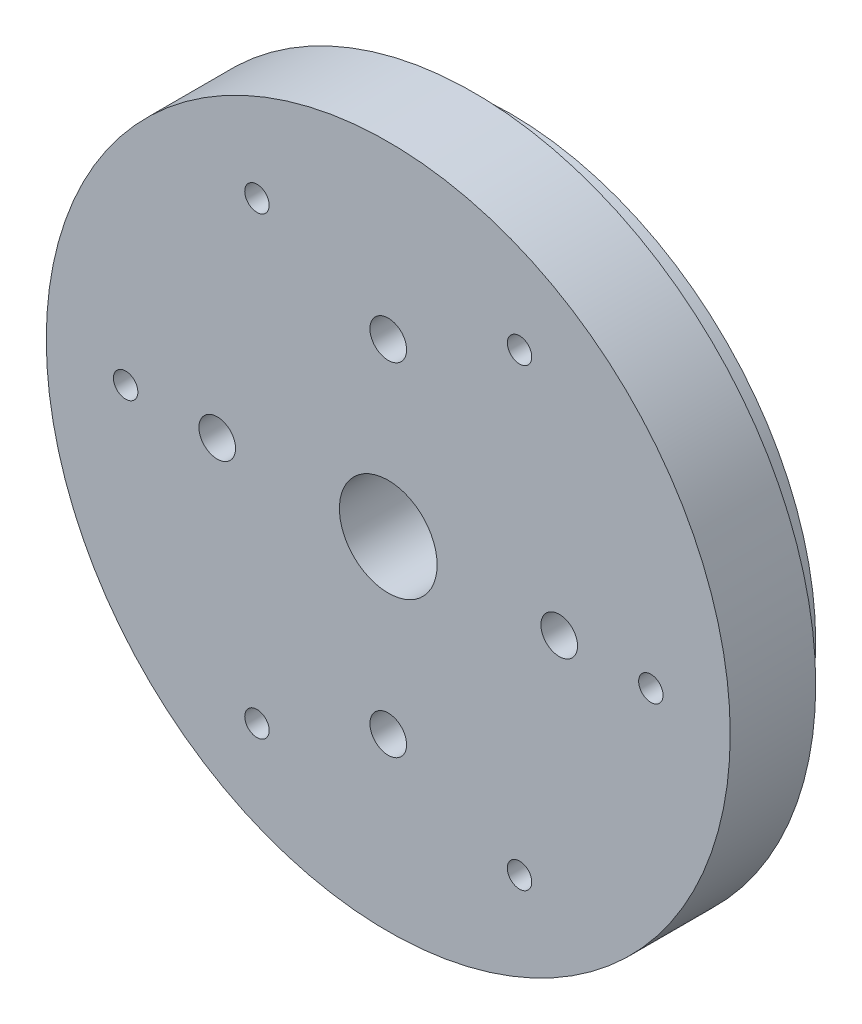
ISO-10303-21;
HEADER;
FILE_DESCRIPTION(('STEP AP214'),'2;1');
FILE_NAME('part.step','',(''),(''),'','','');
FILE_SCHEMA(('AUTOMOTIVE_DESIGN { 1 0 10303 214 1 1 1 1 }'));
ENDSEC;
DATA;
#1=APPLICATION_CONTEXT('core data for automotive mechanical design processes');
#2=APPLICATION_PROTOCOL_DEFINITION('international standard','automotive_design',2000,#1);
#3=PRODUCT_CONTEXT('',#1,'mechanical');
#4=PRODUCT('Part','Part','',(#3));
#5=PRODUCT_RELATED_PRODUCT_CATEGORY('part','',(#4));
#6=PRODUCT_DEFINITION_FORMATION('','',#4);
#7=PRODUCT_DEFINITION_CONTEXT('part definition',#1,'design');
#8=PRODUCT_DEFINITION('design','',#6,#7);
#9=PRODUCT_DEFINITION_SHAPE('','',#8);
#10=(LENGTH_UNIT() NAMED_UNIT(*) SI_UNIT(.MILLI.,.METRE.));
#11=(NAMED_UNIT(*) PLANE_ANGLE_UNIT() SI_UNIT($,.RADIAN.));
#12=(NAMED_UNIT(*) SI_UNIT($,.STERADIAN.) SOLID_ANGLE_UNIT());
#13=UNCERTAINTY_MEASURE_WITH_UNIT(LENGTH_MEASURE(1.E-05),#10,'distance_accuracy_value','');
#14=(GEOMETRIC_REPRESENTATION_CONTEXT(3) GLOBAL_UNCERTAINTY_ASSIGNED_CONTEXT((#13)) GLOBAL_UNIT_ASSIGNED_CONTEXT((#10,
#11,#12)) REPRESENTATION_CONTEXT('',''));
#15=CARTESIAN_POINT('',(0.,0.,0.));
#16=DIRECTION('',(0.,0.,1.));
#17=DIRECTION('',(1.,0.,0.));
#18=AXIS2_PLACEMENT_3D('',#15,#16,#17);
#19=CARTESIAN_POINT('',(0.,0.,0.));
#20=DIRECTION('',(0.,0.,1.));
#21=DIRECTION('',(1.,0.,0.));
#22=AXIS2_PLACEMENT_3D('',#19,#20,#21);
#23=PLANE('',#22);
#24=CARTESIAN_POINT('',(-14.,0.,0.));
#25=DIRECTION('',(0.,0.,1.));
#26=DIRECTION('',(1.,0.,0.));
#27=AXIS2_PLACEMENT_3D('',#24,#25,#26);
#28=CIRCLE('',#27,1.5);
#29=CARTESIAN_POINT('',(-12.5,0.,0.));
#30=VERTEX_POINT('',#29);
#31=EDGE_CURVE('E76',#30,#30,#28,.T.);
#32=ORIENTED_EDGE('',*,*,#31,.T.);
#33=EDGE_LOOP('',(#32));
#34=FACE_BOUND('',#33,.T.);
#35=CARTESIAN_POINT('',(0.,-14.,0.));
#36=DIRECTION('',(0.,0.,1.));
#37=DIRECTION('',(1.,0.,0.));
#38=AXIS2_PLACEMENT_3D('',#35,#36,#37);
#39=CIRCLE('',#38,1.5);
#40=CARTESIAN_POINT('',(1.5,-14.,0.));
#41=VERTEX_POINT('',#40);
#42=EDGE_CURVE('E70',#41,#41,#39,.T.);
#43=ORIENTED_EDGE('',*,*,#42,.T.);
#44=EDGE_LOOP('',(#43));
#45=FACE_BOUND('',#44,.T.);
#46=CARTESIAN_POINT('',(14.,0.,0.));
#47=DIRECTION('',(0.,0.,1.));
#48=DIRECTION('',(1.,0.,0.));
#49=AXIS2_PLACEMENT_3D('',#46,#47,#48);
#50=CIRCLE('',#49,1.5);
#51=CARTESIAN_POINT('',(15.5,0.,0.));
#52=VERTEX_POINT('',#51);
#53=EDGE_CURVE('E64',#52,#52,#50,.T.);
#54=ORIENTED_EDGE('',*,*,#53,.T.);
#55=EDGE_LOOP('',(#54));
#56=FACE_BOUND('',#55,.T.);
#57=CARTESIAN_POINT('',(0.,14.,0.));
#58=DIRECTION('',(0.,0.,1.));
#59=DIRECTION('',(1.,0.,0.));
#60=AXIS2_PLACEMENT_3D('',#57,#58,#59);
#61=CIRCLE('',#60,1.5);
#62=CARTESIAN_POINT('',(1.5,14.,0.));
#63=VERTEX_POINT('',#62);
#64=EDGE_CURVE('E58',#63,#63,#61,.T.);
#65=ORIENTED_EDGE('',*,*,#64,.T.);
#66=EDGE_LOOP('',(#65));
#67=FACE_BOUND('',#66,.T.);
#68=CARTESIAN_POINT('',(0.,0.,0.));
#69=DIRECTION('',(0.,0.,1.));
#70=DIRECTION('',(1.,0.,0.));
#71=AXIS2_PLACEMENT_3D('',#68,#69,#70);
#72=CIRCLE('',#71,4.);
#73=CARTESIAN_POINT('',(4.,0.,0.));
#74=VERTEX_POINT('',#73);
#75=EDGE_CURVE('E52',#74,#74,#72,.T.);
#76=ORIENTED_EDGE('',*,*,#75,.T.);
#77=EDGE_LOOP('',(#76));
#78=FACE_BOUND('',#77,.T.);
#79=CARTESIAN_POINT('',(0.,0.,0.));
#80=DIRECTION('',(0.,0.,-1.));
#81=DIRECTION('',(-1.,0.,0.));
#82=AXIS2_PLACEMENT_3D('',#79,#80,#81);
#83=CIRCLE('',#82,18.);
#84=CARTESIAN_POINT('',(-18.,0.,0.));
#85=VERTEX_POINT('',#84);
#86=EDGE_CURVE('E85',#85,#85,#83,.T.);
#87=ORIENTED_EDGE('',*,*,#86,.T.);
#88=EDGE_LOOP('',(#87));
#89=FACE_BOUND('',#88,.T.);
#90=ADVANCED_FACE('F34',(#34,#45,#56,#67,#78,#89),#23,.F.);
#91=CARTESIAN_POINT('',(0.,0.,7.));
#92=DIRECTION('',(0.,0.,1.));
#93=DIRECTION('',(1.,0.,0.));
#94=AXIS2_PLACEMENT_3D('',#91,#92,#93);
#95=PLANE('',#94);
#96=CARTESIAN_POINT('',(21.5,0.,7.));
#97=DIRECTION('',(0.,0.,-1.));
#98=DIRECTION('',(-1.,0.,0.));
#99=AXIS2_PLACEMENT_3D('',#96,#97,#98);
#100=CIRCLE('',#99,1.);
#101=CARTESIAN_POINT('',(20.5,0.,7.));
#102=VERTEX_POINT('',#101);
#103=EDGE_CURVE('E100',#102,#102,#100,.T.);
#104=ORIENTED_EDGE('',*,*,#103,.T.);
#105=EDGE_LOOP('',(#104));
#106=FACE_BOUND('',#105,.T.);
#107=CARTESIAN_POINT('',(10.7500000000001,-18.6195461813654,7.));
#108=DIRECTION('',(0.,0.,-1.));
#109=DIRECTION('',(-1.,0.,0.));
#110=AXIS2_PLACEMENT_3D('',#107,#108,#109);
#111=CIRCLE('',#110,1.);
#112=CARTESIAN_POINT('',(9.75000000000009,-18.6195461813654,7.));
#113=VERTEX_POINT('',#112);
#114=EDGE_CURVE('E106',#113,#113,#111,.T.);
#115=ORIENTED_EDGE('',*,*,#114,.T.);
#116=EDGE_LOOP('',(#115));
#117=FACE_BOUND('',#116,.T.);
#118=CARTESIAN_POINT('',(-10.75,-18.6195461813655,7.));
#119=DIRECTION('',(0.,0.,-1.));
#120=DIRECTION('',(-1.,0.,0.));
#121=AXIS2_PLACEMENT_3D('',#118,#119,#120);
#122=CIRCLE('',#121,1.);
#123=CARTESIAN_POINT('',(-11.75,-18.6195461813655,7.));
#124=VERTEX_POINT('',#123);
#125=EDGE_CURVE('E112',#124,#124,#122,.T.);
#126=ORIENTED_EDGE('',*,*,#125,.T.);
#127=EDGE_LOOP('',(#126));
#128=FACE_BOUND('',#127,.T.);
#129=CARTESIAN_POINT('',(-21.5,0.,7.));
#130=DIRECTION('',(0.,0.,-1.));
#131=DIRECTION('',(-1.,0.,0.));
#132=AXIS2_PLACEMENT_3D('',#129,#130,#131);
#133=CIRCLE('',#132,1.);
#134=CARTESIAN_POINT('',(-22.5,0.,7.));
#135=VERTEX_POINT('',#134);
#136=EDGE_CURVE('E118',#135,#135,#133,.T.);
#137=ORIENTED_EDGE('',*,*,#136,.T.);
#138=EDGE_LOOP('',(#137));
#139=FACE_BOUND('',#138,.T.);
#140=CARTESIAN_POINT('',(-10.7500000000001,18.6195461813654,7.));
#141=DIRECTION('',(0.,0.,-1.));
#142=DIRECTION('',(-1.,0.,0.));
#143=AXIS2_PLACEMENT_3D('',#140,#141,#142);
#144=CIRCLE('',#143,1.);
#145=CARTESIAN_POINT('',(-11.7500000000001,18.6195461813654,7.));
#146=VERTEX_POINT('',#145);
#147=EDGE_CURVE('E94',#146,#146,#144,.T.);
#148=ORIENTED_EDGE('',*,*,#147,.T.);
#149=EDGE_LOOP('',(#148));
#150=FACE_BOUND('',#149,.T.);
#151=CARTESIAN_POINT('',(10.75,18.6195461813655,7.));
#152=DIRECTION('',(0.,0.,-1.));
#153=DIRECTION('',(-1.,0.,0.));
#154=AXIS2_PLACEMENT_3D('',#151,#152,#153);
#155=CIRCLE('',#154,1.);
#156=CARTESIAN_POINT('',(9.74999999999995,18.6195461813655,7.));
#157=VERTEX_POINT('',#156);
#158=EDGE_CURVE('E88',#157,#157,#155,.T.);
#159=ORIENTED_EDGE('',*,*,#158,.T.);
#160=EDGE_LOOP('',(#159));
#161=FACE_BOUND('',#160,.T.);
#162=CARTESIAN_POINT('',(0.,-14.,7.));
#163=DIRECTION('',(0.,0.,1.));
#164=DIRECTION('',(1.,0.,0.));
#165=AXIS2_PLACEMENT_3D('',#162,#163,#164);
#166=CIRCLE('',#165,1.5);
#167=CARTESIAN_POINT('',(1.5,-14.,7.));
#168=VERTEX_POINT('',#167);
#169=EDGE_CURVE('E67',#168,#168,#166,.T.);
#170=ORIENTED_EDGE('',*,*,#169,.F.);
#171=EDGE_LOOP('',(#170));
#172=FACE_BOUND('',#171,.T.);
#173=CARTESIAN_POINT('',(0.,14.,7.));
#174=DIRECTION('',(0.,0.,1.));
#175=DIRECTION('',(1.,0.,0.));
#176=AXIS2_PLACEMENT_3D('',#173,#174,#175);
#177=CIRCLE('',#176,1.5);
#178=CARTESIAN_POINT('',(1.5,14.,7.));
#179=VERTEX_POINT('',#178);
#180=EDGE_CURVE('E55',#179,#179,#177,.T.);
#181=ORIENTED_EDGE('',*,*,#180,.F.);
#182=EDGE_LOOP('',(#181));
#183=FACE_BOUND('',#182,.T.);
#184=CARTESIAN_POINT('',(0.,0.,7.));
#185=DIRECTION('',(0.,0.,1.));
#186=DIRECTION('',(1.,0.,0.));
#187=AXIS2_PLACEMENT_3D('',#184,#185,#186);
#188=CIRCLE('',#187,28.);
#189=CARTESIAN_POINT('',(28.,0.,7.));
#190=VERTEX_POINT('',#189);
#191=EDGE_CURVE('E41',#190,#190,#188,.T.);
#192=ORIENTED_EDGE('',*,*,#191,.T.);
#193=EDGE_LOOP('',(#192));
#194=FACE_BOUND('',#193,.T.);
#195=CARTESIAN_POINT('',(0.,0.,7.));
#196=DIRECTION('',(0.,0.,1.));
#197=DIRECTION('',(1.,0.,0.));
#198=AXIS2_PLACEMENT_3D('',#195,#196,#197);
#199=CIRCLE('',#198,4.);
#200=CARTESIAN_POINT('',(4.,0.,7.));
#201=VERTEX_POINT('',#200);
#202=EDGE_CURVE('E50',#201,#201,#199,.T.);
#203=ORIENTED_EDGE('',*,*,#202,.F.);
#204=EDGE_LOOP('',(#203));
#205=FACE_BOUND('',#204,.T.);
#206=CARTESIAN_POINT('',(14.,0.,7.));
#207=DIRECTION('',(0.,0.,1.));
#208=DIRECTION('',(1.,0.,0.));
#209=AXIS2_PLACEMENT_3D('',#206,#207,#208);
#210=CIRCLE('',#209,1.5);
#211=CARTESIAN_POINT('',(15.5,0.,7.));
#212=VERTEX_POINT('',#211);
#213=EDGE_CURVE('E61',#212,#212,#210,.T.);
#214=ORIENTED_EDGE('',*,*,#213,.F.);
#215=EDGE_LOOP('',(#214));
#216=FACE_BOUND('',#215,.T.);
#217=CARTESIAN_POINT('',(-14.,0.,7.));
#218=DIRECTION('',(0.,0.,1.));
#219=DIRECTION('',(1.,0.,0.));
#220=AXIS2_PLACEMENT_3D('',#217,#218,#219);
#221=CIRCLE('',#220,1.5);
#222=CARTESIAN_POINT('',(-12.5,0.,7.));
#223=VERTEX_POINT('',#222);
#224=EDGE_CURVE('E73',#223,#223,#221,.T.);
#225=ORIENTED_EDGE('',*,*,#224,.F.);
#226=EDGE_LOOP('',(#225));
#227=FACE_BOUND('',#226,.T.);
#228=ADVANCED_FACE('F127',(#106,#117,#128,#139,#150,#161,#172,#183,#194,#205,#216,#227),#95,.T.);
#229=CARTESIAN_POINT('',(0.,0.,0.));
#230=DIRECTION('',(0.,0.,1.));
#231=DIRECTION('',(1.,0.,0.));
#232=AXIS2_PLACEMENT_3D('',#229,#230,#231);
#233=CIRCLE('',#232,25.);
#234=CARTESIAN_POINT('',(25.,0.,0.));
#235=VERTEX_POINT('',#234);
#236=EDGE_CURVE('E10',#235,#235,#233,.F.);
#237=ORIENTED_EDGE('',*,*,#236,.F.);
#238=EDGE_LOOP('',(#237));
#239=FACE_BOUND('',#238,.T.);
#240=CARTESIAN_POINT('',(0.,0.,0.));
#241=DIRECTION('',(0.,0.,1.));
#242=DIRECTION('',(1.,0.,0.));
#243=AXIS2_PLACEMENT_3D('',#240,#241,#242);
#244=CIRCLE('',#243,28.);
#245=CARTESIAN_POINT('',(28.,0.,0.));
#246=VERTEX_POINT('',#245);
#247=EDGE_CURVE('E45',#246,#246,#244,.T.);
#248=ORIENTED_EDGE('',*,*,#247,.F.);
#249=EDGE_LOOP('',(#248));
#250=FACE_BOUND('',#249,.T.);
#251=ADVANCED_FACE('F159',(#239,#250),#23,.F.);
#252=CARTESIAN_POINT('',(0.,0.,7.));
#253=DIRECTION('',(0.,0.,-1.));
#254=DIRECTION('',(-1.,0.,0.));
#255=AXIS2_PLACEMENT_3D('',#252,#253,#254);
#256=CYLINDRICAL_SURFACE('',#255,28.);
#257=ORIENTED_EDGE('',*,*,#191,.F.);
#258=EDGE_LOOP('',(#257));
#259=FACE_BOUND('',#258,.T.);
#260=ORIENTED_EDGE('',*,*,#247,.T.);
#261=EDGE_LOOP('',(#260));
#262=FACE_BOUND('',#261,.T.);
#263=ADVANCED_FACE('F36',(#259,#262),#256,.T.);
#264=CARTESIAN_POINT('',(0.,0.,7.));
#265=DIRECTION('',(0.,0.,-1.));
#266=DIRECTION('',(-1.,0.,0.));
#267=AXIS2_PLACEMENT_3D('',#264,#265,#266);
#268=CYLINDRICAL_SURFACE('',#267,4.);
#269=ORIENTED_EDGE('',*,*,#202,.T.);
#270=EDGE_LOOP('',(#269));
#271=FACE_BOUND('',#270,.T.);
#272=ORIENTED_EDGE('',*,*,#75,.F.);
#273=EDGE_LOOP('',(#272));
#274=FACE_BOUND('',#273,.T.);
#275=ADVANCED_FACE('F171',(#271,#274),#268,.F.);
#276=CARTESIAN_POINT('',(0.,14.,7.));
#277=DIRECTION('',(0.,0.,-1.));
#278=DIRECTION('',(-1.,0.,0.));
#279=AXIS2_PLACEMENT_3D('',#276,#277,#278);
#280=CYLINDRICAL_SURFACE('',#279,1.5);
#281=ORIENTED_EDGE('',*,*,#180,.T.);
#282=EDGE_LOOP('',(#281));
#283=FACE_BOUND('',#282,.T.);
#284=ORIENTED_EDGE('',*,*,#64,.F.);
#285=EDGE_LOOP('',(#284));
#286=FACE_BOUND('',#285,.T.);
#287=ADVANCED_FACE('F179',(#283,#286),#280,.F.);
#288=CARTESIAN_POINT('',(14.,0.,7.));
#289=DIRECTION('',(0.,0.,-1.));
#290=DIRECTION('',(-1.,0.,0.));
#291=AXIS2_PLACEMENT_3D('',#288,#289,#290);
#292=CYLINDRICAL_SURFACE('',#291,1.5);
#293=ORIENTED_EDGE('',*,*,#213,.T.);
#294=EDGE_LOOP('',(#293));
#295=FACE_BOUND('',#294,.T.);
#296=ORIENTED_EDGE('',*,*,#53,.F.);
#297=EDGE_LOOP('',(#296));
#298=FACE_BOUND('',#297,.T.);
#299=ADVANCED_FACE('F185',(#295,#298),#292,.F.);
#300=CARTESIAN_POINT('',(0.,-14.,7.));
#301=DIRECTION('',(0.,0.,-1.));
#302=DIRECTION('',(-1.,0.,0.));
#303=AXIS2_PLACEMENT_3D('',#300,#301,#302);
#304=CYLINDRICAL_SURFACE('',#303,1.5);
#305=ORIENTED_EDGE('',*,*,#169,.T.);
#306=EDGE_LOOP('',(#305));
#307=FACE_BOUND('',#306,.T.);
#308=ORIENTED_EDGE('',*,*,#42,.F.);
#309=EDGE_LOOP('',(#308));
#310=FACE_BOUND('',#309,.T.);
#311=ADVANCED_FACE('F192',(#307,#310),#304,.F.);
#312=CARTESIAN_POINT('',(-14.,0.,7.));
#313=DIRECTION('',(0.,0.,-1.));
#314=DIRECTION('',(-1.,0.,0.));
#315=AXIS2_PLACEMENT_3D('',#312,#313,#314);
#316=CYLINDRICAL_SURFACE('',#315,1.5);
#317=ORIENTED_EDGE('',*,*,#224,.T.);
#318=EDGE_LOOP('',(#317));
#319=FACE_BOUND('',#318,.T.);
#320=ORIENTED_EDGE('',*,*,#31,.F.);
#321=EDGE_LOOP('',(#320));
#322=FACE_BOUND('',#321,.T.);
#323=ADVANCED_FACE('F142',(#319,#322),#316,.F.);
#324=CARTESIAN_POINT('',(0.,0.,-3.));
#325=DIRECTION('',(0.,0.,-1.));
#326=DIRECTION('',(-1.,0.,0.));
#327=AXIS2_PLACEMENT_3D('',#324,#325,#326);
#328=PLANE('',#327);
#329=CARTESIAN_POINT('',(21.5,0.,-3.));
#330=DIRECTION('',(0.,0.,-1.));
#331=DIRECTION('',(-1.,0.,0.));
#332=AXIS2_PLACEMENT_3D('',#329,#330,#331);
#333=CIRCLE('',#332,1.);
#334=CARTESIAN_POINT('',(20.5,0.,-3.));
#335=VERTEX_POINT('',#334);
#336=EDGE_CURVE('E97',#335,#335,#333,.T.);
#337=ORIENTED_EDGE('',*,*,#336,.F.);
#338=EDGE_LOOP('',(#337));
#339=FACE_BOUND('',#338,.T.);
#340=CARTESIAN_POINT('',(10.7500000000001,-18.6195461813654,-3.));
#341=DIRECTION('',(0.,0.,-1.));
#342=DIRECTION('',(-1.,0.,0.));
#343=AXIS2_PLACEMENT_3D('',#340,#341,#342);
#344=CIRCLE('',#343,1.);
#345=CARTESIAN_POINT('',(9.75000000000009,-18.6195461813654,-3.));
#346=VERTEX_POINT('',#345);
#347=EDGE_CURVE('E103',#346,#346,#344,.T.);
#348=ORIENTED_EDGE('',*,*,#347,.F.);
#349=EDGE_LOOP('',(#348));
#350=FACE_BOUND('',#349,.T.);
#351=CARTESIAN_POINT('',(-10.75,-18.6195461813655,-3.));
#352=DIRECTION('',(0.,0.,-1.));
#353=DIRECTION('',(-1.,0.,0.));
#354=AXIS2_PLACEMENT_3D('',#351,#352,#353);
#355=CIRCLE('',#354,1.);
#356=CARTESIAN_POINT('',(-11.75,-18.6195461813655,-3.));
#357=VERTEX_POINT('',#356);
#358=EDGE_CURVE('E109',#357,#357,#355,.T.);
#359=ORIENTED_EDGE('',*,*,#358,.F.);
#360=EDGE_LOOP('',(#359));
#361=FACE_BOUND('',#360,.T.);
#362=CARTESIAN_POINT('',(-21.5,0.,-3.));
#363=DIRECTION('',(0.,0.,-1.));
#364=DIRECTION('',(-1.,0.,0.));
#365=AXIS2_PLACEMENT_3D('',#362,#363,#364);
#366=CIRCLE('',#365,1.);
#367=CARTESIAN_POINT('',(-22.5,0.,-3.));
#368=VERTEX_POINT('',#367);
#369=EDGE_CURVE('E115',#368,#368,#366,.T.);
#370=ORIENTED_EDGE('',*,*,#369,.F.);
#371=EDGE_LOOP('',(#370));
#372=FACE_BOUND('',#371,.T.);
#373=CARTESIAN_POINT('',(-10.7500000000001,18.6195461813654,-3.));
#374=DIRECTION('',(0.,0.,-1.));
#375=DIRECTION('',(-1.,0.,0.));
#376=AXIS2_PLACEMENT_3D('',#373,#374,#375);
#377=CIRCLE('',#376,1.);
#378=CARTESIAN_POINT('',(-11.7500000000001,18.6195461813654,-3.));
#379=VERTEX_POINT('',#378);
#380=EDGE_CURVE('E121',#379,#379,#377,.T.);
#381=ORIENTED_EDGE('',*,*,#380,.F.);
#382=EDGE_LOOP('',(#381));
#383=FACE_BOUND('',#382,.T.);
#384=CARTESIAN_POINT('',(10.75,18.6195461813655,-3.));
#385=DIRECTION('',(0.,0.,-1.));
#386=DIRECTION('',(-1.,0.,0.));
#387=AXIS2_PLACEMENT_3D('',#384,#385,#386);
#388=CIRCLE('',#387,1.);
#389=CARTESIAN_POINT('',(9.74999999999995,18.6195461813655,-3.));
#390=VERTEX_POINT('',#389);
#391=EDGE_CURVE('E91',#390,#390,#388,.T.);
#392=ORIENTED_EDGE('',*,*,#391,.F.);
#393=EDGE_LOOP('',(#392));
#394=FACE_BOUND('',#393,.T.);
#395=CARTESIAN_POINT('',(0.,0.,-3.));
#396=DIRECTION('',(0.,0.,-1.));
#397=DIRECTION('',(-1.,0.,0.));
#398=AXIS2_PLACEMENT_3D('',#395,#396,#397);
#399=CIRCLE('',#398,25.);
#400=CARTESIAN_POINT('',(-25.,0.,-3.));
#401=VERTEX_POINT('',#400);
#402=EDGE_CURVE('E79',#401,#401,#399,.T.);
#403=ORIENTED_EDGE('',*,*,#402,.T.);
#404=EDGE_LOOP('',(#403));
#405=FACE_BOUND('',#404,.T.);
#406=CARTESIAN_POINT('',(0.,0.,-3.));
#407=DIRECTION('',(0.,0.,-1.));
#408=DIRECTION('',(-1.,0.,0.));
#409=AXIS2_PLACEMENT_3D('',#406,#407,#408);
#410=CIRCLE('',#409,18.);
#411=CARTESIAN_POINT('',(-18.,0.,-3.));
#412=VERTEX_POINT('',#411);
#413=EDGE_CURVE('E84',#412,#412,#410,.T.);
#414=ORIENTED_EDGE('',*,*,#413,.F.);
#415=EDGE_LOOP('',(#414));
#416=FACE_BOUND('',#415,.T.);
#417=ADVANCED_FACE('F138',(#339,#350,#361,#372,#383,#394,#405,#416),#328,.T.);
#418=CARTESIAN_POINT('',(0.,0.,-3.));
#419=DIRECTION('',(0.,0.,1.));
#420=DIRECTION('',(1.,0.,0.));
#421=AXIS2_PLACEMENT_3D('',#418,#419,#420);
#422=CYLINDRICAL_SURFACE('',#421,25.);
#423=ORIENTED_EDGE('',*,*,#402,.F.);
#424=EDGE_LOOP('',(#423));
#425=FACE_BOUND('',#424,.T.);
#426=ORIENTED_EDGE('',*,*,#236,.T.);
#427=EDGE_LOOP('',(#426));
#428=FACE_BOUND('',#427,.T.);
#429=ADVANCED_FACE('F141',(#425,#428),#422,.T.);
#430=CARTESIAN_POINT('',(0.,0.,-3.));
#431=DIRECTION('',(0.,0.,1.));
#432=DIRECTION('',(1.,0.,0.));
#433=AXIS2_PLACEMENT_3D('',#430,#431,#432);
#434=CYLINDRICAL_SURFACE('',#433,18.);
#435=ORIENTED_EDGE('',*,*,#413,.T.);
#436=EDGE_LOOP('',(#435));
#437=FACE_BOUND('',#436,.T.);
#438=ORIENTED_EDGE('',*,*,#86,.F.);
#439=EDGE_LOOP('',(#438));
#440=FACE_BOUND('',#439,.T.);
#441=ADVANCED_FACE('F151',(#437,#440),#434,.F.);
#442=CARTESIAN_POINT('',(10.75,18.6195461813655,7.));
#443=DIRECTION('',(0.,0.,-1.));
#444=DIRECTION('',(-1.,0.,0.));
#445=AXIS2_PLACEMENT_3D('',#442,#443,#444);
#446=CYLINDRICAL_SURFACE('',#445,1.);
#447=ORIENTED_EDGE('',*,*,#158,.F.);
#448=EDGE_LOOP('',(#447));
#449=FACE_BOUND('',#448,.T.);
#450=ORIENTED_EDGE('',*,*,#391,.T.);
#451=EDGE_LOOP('',(#450));
#452=FACE_BOUND('',#451,.T.);
#453=ADVANCED_FACE('F134',(#449,#452),#446,.F.);
#454=CARTESIAN_POINT('',(-10.7500000000001,18.6195461813654,7.));
#455=DIRECTION('',(0.,0.,-1.));
#456=DIRECTION('',(-1.,0.,0.));
#457=AXIS2_PLACEMENT_3D('',#454,#455,#456);
#458=CYLINDRICAL_SURFACE('',#457,1.);
#459=ORIENTED_EDGE('',*,*,#147,.F.);
#460=EDGE_LOOP('',(#459));
#461=FACE_BOUND('',#460,.T.);
#462=ORIENTED_EDGE('',*,*,#380,.T.);
#463=EDGE_LOOP('',(#462));
#464=FACE_BOUND('',#463,.T.);
#465=ADVANCED_FACE('F130',(#461,#464),#458,.F.);
#466=CARTESIAN_POINT('',(-21.5,0.,7.));
#467=DIRECTION('',(0.,0.,-1.));
#468=DIRECTION('',(-1.,0.,0.));
#469=AXIS2_PLACEMENT_3D('',#466,#467,#468);
#470=CYLINDRICAL_SURFACE('',#469,1.);
#471=ORIENTED_EDGE('',*,*,#136,.F.);
#472=EDGE_LOOP('',(#471));
#473=FACE_BOUND('',#472,.T.);
#474=ORIENTED_EDGE('',*,*,#369,.T.);
#475=EDGE_LOOP('',(#474));
#476=FACE_BOUND('',#475,.T.);
#477=ADVANCED_FACE('F133',(#473,#476),#470,.F.);
#478=CARTESIAN_POINT('',(-10.75,-18.6195461813655,7.));
#479=DIRECTION('',(0.,0.,-1.));
#480=DIRECTION('',(-1.,0.,0.));
#481=AXIS2_PLACEMENT_3D('',#478,#479,#480);
#482=CYLINDRICAL_SURFACE('',#481,1.);
#483=ORIENTED_EDGE('',*,*,#125,.F.);
#484=EDGE_LOOP('',(#483));
#485=FACE_BOUND('',#484,.T.);
#486=ORIENTED_EDGE('',*,*,#358,.T.);
#487=EDGE_LOOP('',(#486));
#488=FACE_BOUND('',#487,.T.);
#489=ADVANCED_FACE('F213',(#485,#488),#482,.F.);
#490=CARTESIAN_POINT('',(10.7500000000001,-18.6195461813654,7.));
#491=DIRECTION('',(0.,0.,-1.));
#492=DIRECTION('',(-1.,0.,0.));
#493=AXIS2_PLACEMENT_3D('',#490,#491,#492);
#494=CYLINDRICAL_SURFACE('',#493,1.);
#495=ORIENTED_EDGE('',*,*,#114,.F.);
#496=EDGE_LOOP('',(#495));
#497=FACE_BOUND('',#496,.T.);
#498=ORIENTED_EDGE('',*,*,#347,.T.);
#499=EDGE_LOOP('',(#498));
#500=FACE_BOUND('',#499,.T.);
#501=ADVANCED_FACE('F209',(#497,#500),#494,.F.);
#502=CARTESIAN_POINT('',(21.5,0.,7.));
#503=DIRECTION('',(0.,0.,-1.));
#504=DIRECTION('',(-1.,0.,0.));
#505=AXIS2_PLACEMENT_3D('',#502,#503,#504);
#506=CYLINDRICAL_SURFACE('',#505,1.);
#507=ORIENTED_EDGE('',*,*,#103,.F.);
#508=EDGE_LOOP('',(#507));
#509=FACE_BOUND('',#508,.T.);
#510=ORIENTED_EDGE('',*,*,#336,.T.);
#511=EDGE_LOOP('',(#510));
#512=FACE_BOUND('',#511,.T.);
#513=ADVANCED_FACE('F206',(#509,#512),#506,.F.);
#514=CLOSED_SHELL('',(#90,#228,#251,#263,#275,#287,#299,#311,#323,#417,#429,#441,#453,#465,#477,
#489,#501,#513));
#515=MANIFOLD_SOLID_BREP('B2',#514);
#516=ADVANCED_BREP_SHAPE_REPRESENTATION('',(#18,#515),#14);
#517=SHAPE_DEFINITION_REPRESENTATION(#9,#516);
ENDSEC;
END-ISO-10303-21;
